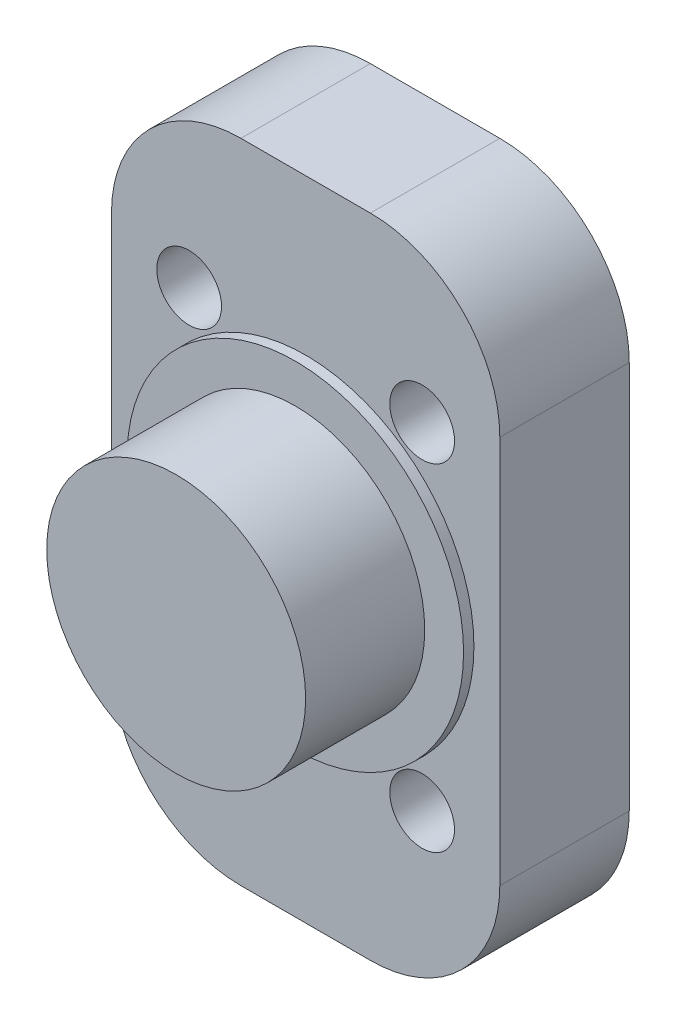
ISO-10303-21;
HEADER;
FILE_DESCRIPTION(('STEP AP214'),'2;1');
FILE_NAME('part.step','',(''),(''),'','','');
FILE_SCHEMA(('AUTOMOTIVE_DESIGN { 1 0 10303 214 1 1 1 1 }'));
ENDSEC;
DATA;
#1=APPLICATION_CONTEXT('core data for automotive mechanical design processes');
#2=APPLICATION_PROTOCOL_DEFINITION('international standard','automotive_design',2000,#1);
#3=PRODUCT_CONTEXT('',#1,'mechanical');
#4=PRODUCT('Part','Part','',(#3));
#5=PRODUCT_RELATED_PRODUCT_CATEGORY('part','',(#4));
#6=PRODUCT_DEFINITION_FORMATION('','',#4);
#7=PRODUCT_DEFINITION_CONTEXT('part definition',#1,'design');
#8=PRODUCT_DEFINITION('design','',#6,#7);
#9=PRODUCT_DEFINITION_SHAPE('','',#8);
#10=(LENGTH_UNIT() NAMED_UNIT(*) SI_UNIT(.MILLI.,.METRE.));
#11=(NAMED_UNIT(*) PLANE_ANGLE_UNIT() SI_UNIT($,.RADIAN.));
#12=(NAMED_UNIT(*) SI_UNIT($,.STERADIAN.) SOLID_ANGLE_UNIT());
#13=UNCERTAINTY_MEASURE_WITH_UNIT(LENGTH_MEASURE(1.E-05),#10,'distance_accuracy_value','');
#14=(GEOMETRIC_REPRESENTATION_CONTEXT(3) GLOBAL_UNCERTAINTY_ASSIGNED_CONTEXT((#13)) GLOBAL_UNIT_ASSIGNED_CONTEXT((#10,
#11,#12)) REPRESENTATION_CONTEXT('',''));
#15=CARTESIAN_POINT('',(0.,0.,0.));
#16=DIRECTION('',(0.,0.,1.));
#17=DIRECTION('',(1.,0.,0.));
#18=AXIS2_PLACEMENT_3D('',#15,#16,#17);
#19=CARTESIAN_POINT('',(-7.5,12.5,-5.));
#20=DIRECTION('',(-1.,0.,0.));
#21=DIRECTION('',(0.,-1.,0.));
#22=AXIS2_PLACEMENT_3D('',#19,#20,#21);
#23=PLANE('',#22);
#24=DIRECTION('',(0.,-1.,0.));
#25=VECTOR('',#24,1.);
#26=CARTESIAN_POINT('',(-7.5,12.5,-5.));
#27=LINE('',#26,#25);
#28=CARTESIAN_POINT('',(-7.5,7.5,-5.));
#29=VERTEX_POINT('',#28);
#30=CARTESIAN_POINT('',(-7.5,-7.5,-5.));
#31=VERTEX_POINT('',#30);
#32=EDGE_CURVE('E164',#29,#31,#27,.T.);
#33=ORIENTED_EDGE('',*,*,#32,.T.);
#34=DIRECTION('',(0.,0.,1.));
#35=VECTOR('',#34,1.);
#36=CARTESIAN_POINT('',(-7.5,-7.5,-5.));
#37=LINE('',#36,#35);
#38=CARTESIAN_POINT('',(-7.5,-7.5,0.));
#39=VERTEX_POINT('',#38);
#40=EDGE_CURVE('E109',#31,#39,#37,.T.);
#41=ORIENTED_EDGE('',*,*,#40,.T.);
#42=DIRECTION('',(0.,-1.,0.));
#43=VECTOR('',#42,1.);
#44=CARTESIAN_POINT('',(-7.5,12.5,0.));
#45=LINE('',#44,#43);
#46=CARTESIAN_POINT('',(-7.5,7.5,0.));
#47=VERTEX_POINT('',#46);
#48=EDGE_CURVE('E101',#47,#39,#45,.T.);
#49=ORIENTED_EDGE('',*,*,#48,.F.);
#50=DIRECTION('',(0.,0.,1.));
#51=VECTOR('',#50,1.);
#52=CARTESIAN_POINT('',(-7.5,7.5,-5.));
#53=LINE('',#52,#51);
#54=EDGE_CURVE('E114',#47,#29,#53,.F.);
#55=ORIENTED_EDGE('',*,*,#54,.T.);
#56=EDGE_LOOP('',(#33,#41,#49,#55));
#57=FACE_BOUND('',#56,.T.);
#58=ADVANCED_FACE('F32',(#57),#23,.T.);
#59=CARTESIAN_POINT('',(-7.5,12.5,-5.));
#60=DIRECTION('',(0.,-1.,0.));
#61=DIRECTION('',(0.,0.,-1.));
#62=AXIS2_PLACEMENT_3D('',#59,#60,#61);
#63=PLANE('',#62);
#64=DIRECTION('',(1.,0.,0.));
#65=VECTOR('',#64,1.);
#66=CARTESIAN_POINT('',(-7.5,12.5,0.));
#67=LINE('',#66,#65);
#68=CARTESIAN_POINT('',(-2.5,12.5,0.));
#69=VERTEX_POINT('',#68);
#70=CARTESIAN_POINT('',(2.5,12.5,0.));
#71=VERTEX_POINT('',#70);
#72=EDGE_CURVE('E103',#69,#71,#67,.T.);
#73=ORIENTED_EDGE('',*,*,#72,.T.);
#74=DIRECTION('',(0.,0.,1.));
#75=VECTOR('',#74,1.);
#76=CARTESIAN_POINT('',(2.5,12.5,-5.));
#77=LINE('',#76,#75);
#78=CARTESIAN_POINT('',(2.5,12.5,-5.));
#79=VERTEX_POINT('',#78);
#80=EDGE_CURVE('E11',#71,#79,#77,.F.);
#81=ORIENTED_EDGE('',*,*,#80,.T.);
#82=DIRECTION('',(1.,0.,0.));
#83=VECTOR('',#82,1.);
#84=CARTESIAN_POINT('',(-7.5,12.5,-5.));
#85=LINE('',#84,#83);
#86=CARTESIAN_POINT('',(-2.5,12.5,-5.));
#87=VERTEX_POINT('',#86);
#88=EDGE_CURVE('E122',#87,#79,#85,.T.);
#89=ORIENTED_EDGE('',*,*,#88,.F.);
#90=DIRECTION('',(0.,0.,1.));
#91=VECTOR('',#90,1.);
#92=CARTESIAN_POINT('',(-2.5,12.5,0.));
#93=LINE('',#92,#91);
#94=EDGE_CURVE('E40',#87,#69,#93,.T.);
#95=ORIENTED_EDGE('',*,*,#94,.T.);
#96=EDGE_LOOP('',(#73,#81,#89,#95));
#97=FACE_BOUND('',#96,.T.);
#98=ADVANCED_FACE('F152',(#97),#63,.F.);
#99=CARTESIAN_POINT('',(7.5,12.5,-5.));
#100=DIRECTION('',(-1.,0.,0.));
#101=DIRECTION('',(0.,-1.,0.));
#102=AXIS2_PLACEMENT_3D('',#99,#100,#101);
#103=PLANE('',#102);
#104=DIRECTION('',(0.,-1.,0.));
#105=VECTOR('',#104,1.);
#106=CARTESIAN_POINT('',(7.5,12.5,0.));
#107=LINE('',#106,#105);
#108=CARTESIAN_POINT('',(7.5,7.5,0.));
#109=VERTEX_POINT('',#108);
#110=CARTESIAN_POINT('',(7.5,-7.5,0.));
#111=VERTEX_POINT('',#110);
#112=EDGE_CURVE('E161',#109,#111,#107,.T.);
#113=ORIENTED_EDGE('',*,*,#112,.T.);
#114=DIRECTION('',(0.,0.,1.));
#115=VECTOR('',#114,1.);
#116=CARTESIAN_POINT('',(7.5,-7.5,-5.));
#117=LINE('',#116,#115);
#118=CARTESIAN_POINT('',(7.5,-7.5,-5.));
#119=VERTEX_POINT('',#118);
#120=EDGE_CURVE('E47',#111,#119,#117,.F.);
#121=ORIENTED_EDGE('',*,*,#120,.T.);
#122=DIRECTION('',(0.,-1.,0.));
#123=VECTOR('',#122,1.);
#124=CARTESIAN_POINT('',(7.5,12.5,-5.));
#125=LINE('',#124,#123);
#126=CARTESIAN_POINT('',(7.5,7.5,-5.));
#127=VERTEX_POINT('',#126);
#128=EDGE_CURVE('E125',#127,#119,#125,.T.);
#129=ORIENTED_EDGE('',*,*,#128,.F.);
#130=DIRECTION('',(0.,0.,1.));
#131=VECTOR('',#130,1.);
#132=CARTESIAN_POINT('',(7.5,7.5,-5.));
#133=LINE('',#132,#131);
#134=EDGE_CURVE('E147',#127,#109,#133,.T.);
#135=ORIENTED_EDGE('',*,*,#134,.T.);
#136=EDGE_LOOP('',(#113,#121,#129,#135));
#137=FACE_BOUND('',#136,.T.);
#138=ADVANCED_FACE('F160',(#137),#103,.F.);
#139=CARTESIAN_POINT('',(-7.5,-12.5,-5.));
#140=DIRECTION('',(0.,-1.,0.));
#141=DIRECTION('',(0.,0.,-1.));
#142=AXIS2_PLACEMENT_3D('',#139,#140,#141);
#143=PLANE('',#142);
#144=DIRECTION('',(1.,0.,0.));
#145=VECTOR('',#144,1.);
#146=CARTESIAN_POINT('',(-7.5,-12.5,0.));
#147=LINE('',#146,#145);
#148=CARTESIAN_POINT('',(-2.5,-12.5,0.));
#149=VERTEX_POINT('',#148);
#150=CARTESIAN_POINT('',(2.5,-12.5,0.));
#151=VERTEX_POINT('',#150);
#152=EDGE_CURVE('E117',#149,#151,#147,.T.);
#153=ORIENTED_EDGE('',*,*,#152,.F.);
#154=DIRECTION('',(0.,0.,1.));
#155=VECTOR('',#154,1.);
#156=CARTESIAN_POINT('',(-2.5,-12.5,-5.));
#157=LINE('',#156,#155);
#158=CARTESIAN_POINT('',(-2.5,-12.5,-5.));
#159=VERTEX_POINT('',#158);
#160=EDGE_CURVE('E139',#149,#159,#157,.F.);
#161=ORIENTED_EDGE('',*,*,#160,.T.);
#162=DIRECTION('',(1.,0.,0.));
#163=VECTOR('',#162,1.);
#164=CARTESIAN_POINT('',(-7.5,-12.5,-5.));
#165=LINE('',#164,#163);
#166=CARTESIAN_POINT('',(2.5,-12.5,-5.));
#167=VERTEX_POINT('',#166);
#168=EDGE_CURVE('E168',#159,#167,#165,.T.);
#169=ORIENTED_EDGE('',*,*,#168,.T.);
#170=DIRECTION('',(0.,0.,1.));
#171=VECTOR('',#170,1.);
#172=CARTESIAN_POINT('',(2.5,-12.5,0.));
#173=LINE('',#172,#171);
#174=EDGE_CURVE('E136',#167,#151,#173,.T.);
#175=ORIENTED_EDGE('',*,*,#174,.T.);
#176=EDGE_LOOP('',(#153,#161,#169,#175));
#177=FACE_BOUND('',#176,.T.);
#178=ADVANCED_FACE('F239',(#177),#143,.T.);
#179=CARTESIAN_POINT('',(0.,0.,-5.));
#180=DIRECTION('',(0.,0.,1.));
#181=DIRECTION('',(1.,0.,0.));
#182=AXIS2_PLACEMENT_3D('',#179,#180,#181);
#183=PLANE('',#182);
#184=CARTESIAN_POINT('',(-4.5,6.5,-5.));
#185=DIRECTION('',(0.,0.,1.));
#186=DIRECTION('',(1.,0.,0.));
#187=AXIS2_PLACEMENT_3D('',#184,#185,#186);
#188=CIRCLE('',#187,1.25);
#189=CARTESIAN_POINT('',(-3.25,6.5,-5.));
#190=VERTEX_POINT('',#189);
#191=EDGE_CURVE('E198',#190,#190,#188,.T.);
#192=ORIENTED_EDGE('',*,*,#191,.T.);
#193=EDGE_LOOP('',(#192));
#194=FACE_BOUND('',#193,.T.);
#195=CARTESIAN_POINT('',(4.49999999999999,6.5,-5.));
#196=DIRECTION('',(0.,0.,1.));
#197=DIRECTION('',(1.,0.,0.));
#198=AXIS2_PLACEMENT_3D('',#195,#196,#197);
#199=CIRCLE('',#198,1.25);
#200=CARTESIAN_POINT('',(5.74999999999999,6.5,-5.));
#201=VERTEX_POINT('',#200);
#202=EDGE_CURVE('E192',#201,#201,#199,.T.);
#203=ORIENTED_EDGE('',*,*,#202,.T.);
#204=EDGE_LOOP('',(#203));
#205=FACE_BOUND('',#204,.T.);
#206=CARTESIAN_POINT('',(4.49999999999999,-6.5,-5.));
#207=DIRECTION('',(0.,0.,1.));
#208=DIRECTION('',(1.,0.,0.));
#209=AXIS2_PLACEMENT_3D('',#206,#207,#208);
#210=CIRCLE('',#209,1.25);
#211=CARTESIAN_POINT('',(5.74999999999999,-6.5,-5.));
#212=VERTEX_POINT('',#211);
#213=EDGE_CURVE('E186',#212,#212,#210,.T.);
#214=ORIENTED_EDGE('',*,*,#213,.T.);
#215=EDGE_LOOP('',(#214));
#216=FACE_BOUND('',#215,.T.);
#217=CARTESIAN_POINT('',(-4.5,-6.5,-5.));
#218=DIRECTION('',(0.,0.,1.));
#219=DIRECTION('',(1.,0.,0.));
#220=AXIS2_PLACEMENT_3D('',#217,#218,#219);
#221=CIRCLE('',#220,1.25);
#222=CARTESIAN_POINT('',(-3.25,-6.5,-5.));
#223=VERTEX_POINT('',#222);
#224=EDGE_CURVE('E180',#223,#223,#221,.T.);
#225=ORIENTED_EDGE('',*,*,#224,.T.);
#226=EDGE_LOOP('',(#225));
#227=FACE_BOUND('',#226,.T.);
#228=ORIENTED_EDGE('',*,*,#168,.F.);
#229=CARTESIAN_POINT('',(-2.5,-7.5,-5.));
#230=DIRECTION('',(0.,0.,1.));
#231=DIRECTION('',(1.,0.,0.));
#232=AXIS2_PLACEMENT_3D('',#229,#230,#231);
#233=CIRCLE('',#232,5.);
#234=EDGE_CURVE('E145',#159,#31,#233,.F.);
#235=ORIENTED_EDGE('',*,*,#234,.T.);
#236=ORIENTED_EDGE('',*,*,#32,.F.);
#237=CARTESIAN_POINT('',(-2.5,7.5,-5.));
#238=DIRECTION('',(0.,0.,1.));
#239=DIRECTION('',(1.,0.,0.));
#240=AXIS2_PLACEMENT_3D('',#237,#238,#239);
#241=CIRCLE('',#240,5.);
#242=EDGE_CURVE('E121',#29,#87,#241,.F.);
#243=ORIENTED_EDGE('',*,*,#242,.T.);
#244=ORIENTED_EDGE('',*,*,#88,.T.);
#245=CARTESIAN_POINT('',(2.5,7.5,-5.));
#246=DIRECTION('',(0.,0.,1.));
#247=DIRECTION('',(1.,0.,0.));
#248=AXIS2_PLACEMENT_3D('',#245,#246,#247);
#249=CIRCLE('',#248,5.);
#250=EDGE_CURVE('E54',#79,#127,#249,.F.);
#251=ORIENTED_EDGE('',*,*,#250,.T.);
#252=ORIENTED_EDGE('',*,*,#128,.T.);
#253=CARTESIAN_POINT('',(2.5,-7.5,-5.));
#254=DIRECTION('',(0.,0.,1.));
#255=DIRECTION('',(1.,0.,0.));
#256=AXIS2_PLACEMENT_3D('',#253,#254,#255);
#257=CIRCLE('',#256,5.);
#258=EDGE_CURVE('E143',#119,#167,#257,.F.);
#259=ORIENTED_EDGE('',*,*,#258,.T.);
#260=EDGE_LOOP('',(#228,#235,#236,#243,#244,#251,#252,#259));
#261=FACE_BOUND('',#260,.T.);
#262=ADVANCED_FACE('F155',(#194,#205,#216,#227,#261),#183,.F.);
#263=CARTESIAN_POINT('',(0.,0.,0.));
#264=DIRECTION('',(0.,0.,1.));
#265=DIRECTION('',(1.,0.,0.));
#266=AXIS2_PLACEMENT_3D('',#263,#264,#265);
#267=PLANE('',#266);
#268=CARTESIAN_POINT('',(-4.5,6.5,0.));
#269=DIRECTION('',(0.,0.,1.));
#270=DIRECTION('',(1.,0.,0.));
#271=AXIS2_PLACEMENT_3D('',#268,#269,#270);
#272=CIRCLE('',#271,1.24999999999999);
#273=CARTESIAN_POINT('',(-3.25000000000001,6.5,0.));
#274=VERTEX_POINT('',#273);
#275=EDGE_CURVE('E201',#274,#274,#272,.T.);
#276=ORIENTED_EDGE('',*,*,#275,.F.);
#277=EDGE_LOOP('',(#276));
#278=FACE_BOUND('',#277,.T.);
#279=CARTESIAN_POINT('',(4.49999999999999,6.5,0.));
#280=DIRECTION('',(0.,0.,1.));
#281=DIRECTION('',(1.,0.,0.));
#282=AXIS2_PLACEMENT_3D('',#279,#280,#281);
#283=CIRCLE('',#282,1.24999999999999);
#284=CARTESIAN_POINT('',(5.74999999999998,6.5,0.));
#285=VERTEX_POINT('',#284);
#286=EDGE_CURVE('E195',#285,#285,#283,.T.);
#287=ORIENTED_EDGE('',*,*,#286,.F.);
#288=EDGE_LOOP('',(#287));
#289=FACE_BOUND('',#288,.T.);
#290=CARTESIAN_POINT('',(4.49999999999999,-6.5,0.));
#291=DIRECTION('',(0.,0.,1.));
#292=DIRECTION('',(1.,0.,0.));
#293=AXIS2_PLACEMENT_3D('',#290,#291,#292);
#294=CIRCLE('',#293,1.24999999999999);
#295=CARTESIAN_POINT('',(5.74999999999998,-6.5,0.));
#296=VERTEX_POINT('',#295);
#297=EDGE_CURVE('E189',#296,#296,#294,.T.);
#298=ORIENTED_EDGE('',*,*,#297,.F.);
#299=EDGE_LOOP('',(#298));
#300=FACE_BOUND('',#299,.T.);
#301=CARTESIAN_POINT('',(-4.5,-6.5,0.));
#302=DIRECTION('',(0.,0.,1.));
#303=DIRECTION('',(1.,0.,0.));
#304=AXIS2_PLACEMENT_3D('',#301,#302,#303);
#305=CIRCLE('',#304,1.24999999999999);
#306=CARTESIAN_POINT('',(-3.25000000000001,-6.5,0.));
#307=VERTEX_POINT('',#306);
#308=EDGE_CURVE('E183',#307,#307,#305,.T.);
#309=ORIENTED_EDGE('',*,*,#308,.F.);
#310=EDGE_LOOP('',(#309));
#311=FACE_BOUND('',#310,.T.);
#312=CARTESIAN_POINT('',(0.,0.,0.));
#313=DIRECTION('',(0.,0.,1.));
#314=DIRECTION('',(1.,0.,0.));
#315=AXIS2_PLACEMENT_3D('',#312,#313,#314);
#316=CIRCLE('',#315,6.5);
#317=CARTESIAN_POINT('',(6.5,0.,0.));
#318=VERTEX_POINT('',#317);
#319=EDGE_CURVE('E172',#318,#318,#316,.T.);
#320=ORIENTED_EDGE('',*,*,#319,.F.);
#321=EDGE_LOOP('',(#320));
#322=FACE_BOUND('',#321,.T.);
#323=ORIENTED_EDGE('',*,*,#48,.T.);
#324=CARTESIAN_POINT('',(-2.5,-7.5,0.));
#325=DIRECTION('',(0.,0.,1.));
#326=DIRECTION('',(1.,0.,0.));
#327=AXIS2_PLACEMENT_3D('',#324,#325,#326);
#328=CIRCLE('',#327,5.);
#329=EDGE_CURVE('E134',#39,#149,#328,.T.);
#330=ORIENTED_EDGE('',*,*,#329,.T.);
#331=ORIENTED_EDGE('',*,*,#152,.T.);
#332=CARTESIAN_POINT('',(2.5,-7.5,0.));
#333=DIRECTION('',(0.,0.,1.));
#334=DIRECTION('',(1.,0.,0.));
#335=AXIS2_PLACEMENT_3D('',#332,#333,#334);
#336=CIRCLE('',#335,5.);
#337=EDGE_CURVE('E132',#151,#111,#336,.T.);
#338=ORIENTED_EDGE('',*,*,#337,.T.);
#339=ORIENTED_EDGE('',*,*,#112,.F.);
#340=CARTESIAN_POINT('',(2.5,7.5,0.));
#341=DIRECTION('',(0.,0.,1.));
#342=DIRECTION('',(1.,0.,0.));
#343=AXIS2_PLACEMENT_3D('',#340,#341,#342);
#344=CIRCLE('',#343,5.);
#345=EDGE_CURVE('E108',#109,#71,#344,.T.);
#346=ORIENTED_EDGE('',*,*,#345,.T.);
#347=ORIENTED_EDGE('',*,*,#72,.F.);
#348=CARTESIAN_POINT('',(-2.5,7.5,0.));
#349=DIRECTION('',(0.,0.,1.));
#350=DIRECTION('',(1.,0.,0.));
#351=AXIS2_PLACEMENT_3D('',#348,#349,#350);
#352=CIRCLE('',#351,5.);
#353=EDGE_CURVE('E98',#69,#47,#352,.T.);
#354=ORIENTED_EDGE('',*,*,#353,.T.);
#355=EDGE_LOOP('',(#323,#330,#331,#338,#339,#346,#347,#354));
#356=FACE_BOUND('',#355,.T.);
#357=ADVANCED_FACE('F100',(#278,#289,#300,#311,#322,#356),#267,.T.);
#358=CARTESIAN_POINT('',(0.,0.,0.4));
#359=DIRECTION('',(0.,0.,-1.));
#360=DIRECTION('',(-1.,0.,0.));
#361=AXIS2_PLACEMENT_3D('',#358,#359,#360);
#362=CYLINDRICAL_SURFACE('',#361,6.5);
#363=CARTESIAN_POINT('',(0.,0.,0.4));
#364=DIRECTION('',(0.,0.,1.));
#365=DIRECTION('',(1.,0.,0.));
#366=AXIS2_PLACEMENT_3D('',#363,#364,#365);
#367=CIRCLE('',#366,6.5);
#368=CARTESIAN_POINT('',(6.5,0.,0.4));
#369=VERTEX_POINT('',#368);
#370=EDGE_CURVE('E118',#369,#369,#367,.T.);
#371=ORIENTED_EDGE('',*,*,#370,.F.);
#372=EDGE_LOOP('',(#371));
#373=FACE_BOUND('',#372,.T.);
#374=ORIENTED_EDGE('',*,*,#319,.T.);
#375=EDGE_LOOP('',(#374));
#376=FACE_BOUND('',#375,.T.);
#377=ADVANCED_FACE('F209',(#373,#376),#362,.T.);
#378=CARTESIAN_POINT('',(0.,0.,0.4));
#379=DIRECTION('',(0.,0.,1.));
#380=DIRECTION('',(1.,0.,0.));
#381=AXIS2_PLACEMENT_3D('',#378,#379,#380);
#382=PLANE('',#381);
#383=CARTESIAN_POINT('',(0.,0.,0.4));
#384=DIRECTION('',(0.,0.,1.));
#385=DIRECTION('',(1.,0.,0.));
#386=AXIS2_PLACEMENT_3D('',#383,#384,#385);
#387=CIRCLE('',#386,5.);
#388=CARTESIAN_POINT('',(5.,0.,0.4));
#389=VERTEX_POINT('',#388);
#390=EDGE_CURVE('E128',#389,#389,#387,.F.);
#391=ORIENTED_EDGE('',*,*,#390,.T.);
#392=EDGE_LOOP('',(#391));
#393=FACE_BOUND('',#392,.T.);
#394=ORIENTED_EDGE('',*,*,#370,.T.);
#395=EDGE_LOOP('',(#394));
#396=FACE_BOUND('',#395,.T.);
#397=ADVANCED_FACE('F220',(#393,#396),#382,.T.);
#398=CARTESIAN_POINT('',(0.,0.,5.));
#399=DIRECTION('',(0.,0.,-1.));
#400=DIRECTION('',(-1.,0.,0.));
#401=AXIS2_PLACEMENT_3D('',#398,#399,#400);
#402=CYLINDRICAL_SURFACE('',#401,5.);
#403=ORIENTED_EDGE('',*,*,#390,.F.);
#404=EDGE_LOOP('',(#403));
#405=FACE_BOUND('',#404,.T.);
#406=CARTESIAN_POINT('',(0.,0.,5.));
#407=DIRECTION('',(0.,0.,1.));
#408=DIRECTION('',(1.,0.,0.));
#409=AXIS2_PLACEMENT_3D('',#406,#407,#408);
#410=CIRCLE('',#409,5.);
#411=CARTESIAN_POINT('',(5.,0.,5.));
#412=VERTEX_POINT('',#411);
#413=EDGE_CURVE('E177',#412,#412,#410,.T.);
#414=ORIENTED_EDGE('',*,*,#413,.F.);
#415=EDGE_LOOP('',(#414));
#416=FACE_BOUND('',#415,.T.);
#417=ADVANCED_FACE('F226',(#405,#416),#402,.T.);
#418=CARTESIAN_POINT('',(0.,0.,5.));
#419=DIRECTION('',(0.,0.,1.));
#420=DIRECTION('',(1.,0.,0.));
#421=AXIS2_PLACEMENT_3D('',#418,#419,#420);
#422=PLANE('',#421);
#423=ORIENTED_EDGE('',*,*,#413,.T.);
#424=EDGE_LOOP('',(#423));
#425=FACE_BOUND('',#424,.T.);
#426=ADVANCED_FACE('F349',(#425),#422,.T.);
#427=CARTESIAN_POINT('',(-4.5,-6.5,0.));
#428=DIRECTION('',(0.,0.,1.));
#429=DIRECTION('',(1.,0.,0.));
#430=AXIS2_PLACEMENT_3D('',#427,#428,#429);
#431=CYLINDRICAL_SURFACE('',#430,1.24999999999999);
#432=ORIENTED_EDGE('',*,*,#224,.F.);
#433=EDGE_LOOP('',(#432));
#434=FACE_BOUND('',#433,.T.);
#435=ORIENTED_EDGE('',*,*,#308,.T.);
#436=EDGE_LOOP('',(#435));
#437=FACE_BOUND('',#436,.T.);
#438=ADVANCED_FACE('F339',(#434,#437),#431,.F.);
#439=CARTESIAN_POINT('',(4.49999999999999,-6.5,0.));
#440=DIRECTION('',(0.,0.,1.));
#441=DIRECTION('',(1.,0.,0.));
#442=AXIS2_PLACEMENT_3D('',#439,#440,#441);
#443=CYLINDRICAL_SURFACE('',#442,1.24999999999999);
#444=ORIENTED_EDGE('',*,*,#213,.F.);
#445=EDGE_LOOP('',(#444));
#446=FACE_BOUND('',#445,.T.);
#447=ORIENTED_EDGE('',*,*,#297,.T.);
#448=EDGE_LOOP('',(#447));
#449=FACE_BOUND('',#448,.T.);
#450=ADVANCED_FACE('F329',(#446,#449),#443,.F.);
#451=CARTESIAN_POINT('',(4.49999999999999,6.5,0.));
#452=DIRECTION('',(0.,0.,1.));
#453=DIRECTION('',(1.,0.,0.));
#454=AXIS2_PLACEMENT_3D('',#451,#452,#453);
#455=CYLINDRICAL_SURFACE('',#454,1.24999999999999);
#456=ORIENTED_EDGE('',*,*,#202,.F.);
#457=EDGE_LOOP('',(#456));
#458=FACE_BOUND('',#457,.T.);
#459=ORIENTED_EDGE('',*,*,#286,.T.);
#460=EDGE_LOOP('',(#459));
#461=FACE_BOUND('',#460,.T.);
#462=ADVANCED_FACE('F319',(#458,#461),#455,.F.);
#463=CARTESIAN_POINT('',(-4.5,6.5,0.));
#464=DIRECTION('',(0.,0.,1.));
#465=DIRECTION('',(1.,0.,0.));
#466=AXIS2_PLACEMENT_3D('',#463,#464,#465);
#467=CYLINDRICAL_SURFACE('',#466,1.24999999999999);
#468=ORIENTED_EDGE('',*,*,#191,.F.);
#469=EDGE_LOOP('',(#468));
#470=FACE_BOUND('',#469,.T.);
#471=ORIENTED_EDGE('',*,*,#275,.T.);
#472=EDGE_LOOP('',(#471));
#473=FACE_BOUND('',#472,.T.);
#474=ADVANCED_FACE('F205',(#470,#473),#467,.F.);
#475=CARTESIAN_POINT('',(-2.5,-7.5,-5.));
#476=DIRECTION('',(0.,0.,1.));
#477=DIRECTION('',(1.,0.,0.));
#478=AXIS2_PLACEMENT_3D('',#475,#476,#477);
#479=CYLINDRICAL_SURFACE('',#478,5.);
#480=ORIENTED_EDGE('',*,*,#234,.F.);
#481=ORIENTED_EDGE('',*,*,#160,.F.);
#482=ORIENTED_EDGE('',*,*,#329,.F.);
#483=ORIENTED_EDGE('',*,*,#40,.F.);
#484=EDGE_LOOP('',(#480,#481,#482,#483));
#485=FACE_BOUND('',#484,.T.);
#486=ADVANCED_FACE('F241',(#485),#479,.T.);
#487=CARTESIAN_POINT('',(2.5,-7.5,-5.));
#488=DIRECTION('',(0.,0.,-1.));
#489=DIRECTION('',(-1.,0.,0.));
#490=AXIS2_PLACEMENT_3D('',#487,#488,#489);
#491=CYLINDRICAL_SURFACE('',#490,5.);
#492=ORIENTED_EDGE('',*,*,#258,.F.);
#493=ORIENTED_EDGE('',*,*,#120,.F.);
#494=ORIENTED_EDGE('',*,*,#337,.F.);
#495=ORIENTED_EDGE('',*,*,#174,.F.);
#496=EDGE_LOOP('',(#492,#493,#494,#495));
#497=FACE_BOUND('',#496,.T.);
#498=ADVANCED_FACE('F244',(#497),#491,.T.);
#499=CARTESIAN_POINT('',(2.5,7.5,-5.));
#500=DIRECTION('',(0.,0.,1.));
#501=DIRECTION('',(1.,0.,0.));
#502=AXIS2_PLACEMENT_3D('',#499,#500,#501);
#503=CYLINDRICAL_SURFACE('',#502,5.);
#504=ORIENTED_EDGE('',*,*,#250,.F.);
#505=ORIENTED_EDGE('',*,*,#80,.F.);
#506=ORIENTED_EDGE('',*,*,#345,.F.);
#507=ORIENTED_EDGE('',*,*,#134,.F.);
#508=EDGE_LOOP('',(#504,#505,#506,#507));
#509=FACE_BOUND('',#508,.T.);
#510=ADVANCED_FACE('F158',(#509),#503,.T.);
#511=CARTESIAN_POINT('',(-2.5,7.5,-5.));
#512=DIRECTION('',(0.,0.,-1.));
#513=DIRECTION('',(-1.,0.,0.));
#514=AXIS2_PLACEMENT_3D('',#511,#512,#513);
#515=CYLINDRICAL_SURFACE('',#514,5.);
#516=ORIENTED_EDGE('',*,*,#242,.F.);
#517=ORIENTED_EDGE('',*,*,#54,.F.);
#518=ORIENTED_EDGE('',*,*,#353,.F.);
#519=ORIENTED_EDGE('',*,*,#94,.F.);
#520=EDGE_LOOP('',(#516,#517,#518,#519));
#521=FACE_BOUND('',#520,.T.);
#522=ADVANCED_FACE('F34',(#521),#515,.T.);
#523=CLOSED_SHELL('',(#58,#98,#138,#178,#262,#357,#377,#397,#417,#426,#438,#450,#462,#474,#486,
#498,#510,#522));
#524=MANIFOLD_SOLID_BREP('B2',#523);
#525=ADVANCED_BREP_SHAPE_REPRESENTATION('',(#18,#524),#14);
#526=SHAPE_DEFINITION_REPRESENTATION(#9,#525);
ENDSEC;
END-ISO-10303-21;
